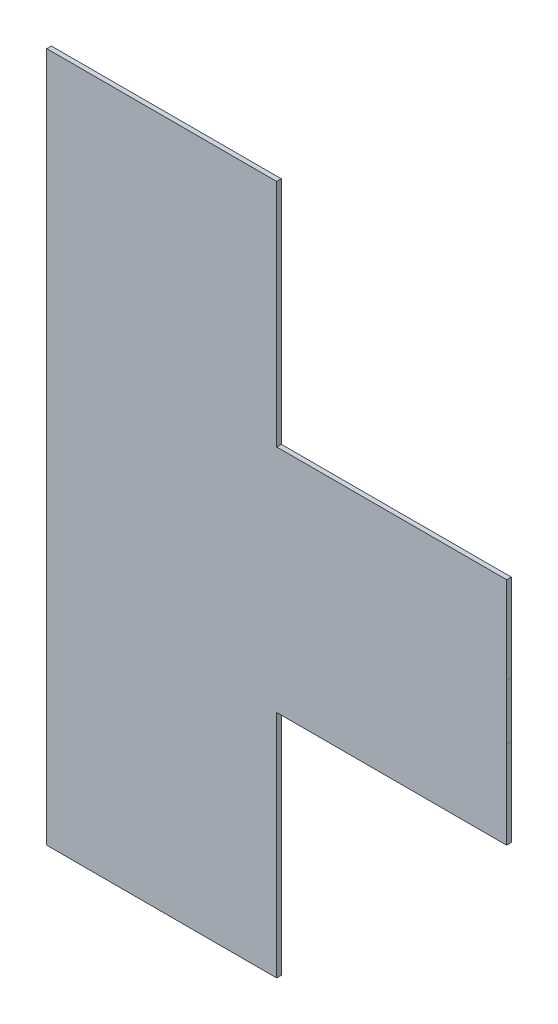
ISO-10303-21;
HEADER;
FILE_DESCRIPTION(('STEP AP214'),'2;1');
FILE_NAME('part.step','',(''),(''),'','','');
FILE_SCHEMA(('AUTOMOTIVE_DESIGN { 1 0 10303 214 1 1 1 1 }'));
ENDSEC;
DATA;
#1=APPLICATION_CONTEXT('core data for automotive mechanical design processes');
#2=APPLICATION_PROTOCOL_DEFINITION('international standard','automotive_design',2000,#1);
#3=PRODUCT_CONTEXT('',#1,'mechanical');
#4=PRODUCT('Part','Part','',(#3));
#5=PRODUCT_RELATED_PRODUCT_CATEGORY('part','',(#4));
#6=PRODUCT_DEFINITION_FORMATION('','',#4);
#7=PRODUCT_DEFINITION_CONTEXT('part definition',#1,'design');
#8=PRODUCT_DEFINITION('design','',#6,#7);
#9=PRODUCT_DEFINITION_SHAPE('','',#8);
#10=(LENGTH_UNIT() NAMED_UNIT(*) SI_UNIT(.MILLI.,.METRE.));
#11=(NAMED_UNIT(*) PLANE_ANGLE_UNIT() SI_UNIT($,.RADIAN.));
#12=(NAMED_UNIT(*) SI_UNIT($,.STERADIAN.) SOLID_ANGLE_UNIT());
#13=UNCERTAINTY_MEASURE_WITH_UNIT(LENGTH_MEASURE(1.E-05),#10,'distance_accuracy_value','');
#14=(GEOMETRIC_REPRESENTATION_CONTEXT(3) GLOBAL_UNCERTAINTY_ASSIGNED_CONTEXT((#13)) GLOBAL_UNIT_ASSIGNED_CONTEXT((#10,
#11,#12)) REPRESENTATION_CONTEXT('',''));
#15=CARTESIAN_POINT('',(0.,0.,0.));
#16=DIRECTION('',(0.,0.,1.));
#17=DIRECTION('',(1.,0.,0.));
#18=AXIS2_PLACEMENT_3D('',#15,#16,#17);
#19=CARTESIAN_POINT('',(100.,2.22044604925031E-13,1.));
#20=DIRECTION('',(1.,0.,0.));
#21=DIRECTION('',(0.,1.,0.));
#22=AXIS2_PLACEMENT_3D('',#19,#20,#21);
#23=PLANE('',#22);
#24=DIRECTION('',(0.,-1.,0.));
#25=VECTOR('',#24,1.);
#26=CARTESIAN_POINT('',(100.,2.22044604925031E-13,0.));
#27=LINE('',#26,#25);
#28=CARTESIAN_POINT('',(99.9999999999998,68.9999999999999,0.));
#29=VERTEX_POINT('',#28);
#30=CARTESIAN_POINT('',(99.9999999999999,50.,0.));
#31=VERTEX_POINT('',#30);
#32=EDGE_CURVE('E177',#29,#31,#27,.T.);
#33=ORIENTED_EDGE('',*,*,#32,.F.);
#34=DIRECTION('',(0.,0.,1.));
#35=VECTOR('',#34,1.);
#36=CARTESIAN_POINT('',(99.9999999999998,68.9999999999999,1.));
#37=LINE('',#36,#35);
#38=CARTESIAN_POINT('',(99.9999999999998,68.9999999999999,1.));
#39=VERTEX_POINT('',#38);
#40=EDGE_CURVE('E11',#29,#39,#37,.T.);
#41=ORIENTED_EDGE('',*,*,#40,.T.);
#42=DIRECTION('',(0.,-1.,0.));
#43=VECTOR('',#42,1.);
#44=CARTESIAN_POINT('',(100.,2.22044604925031E-13,1.));
#45=LINE('',#44,#43);
#46=CARTESIAN_POINT('',(99.9999999999999,50.,1.));
#47=VERTEX_POINT('',#46);
#48=EDGE_CURVE('E145',#39,#47,#45,.T.);
#49=ORIENTED_EDGE('',*,*,#48,.T.);
#50=DIRECTION('',(0.,0.,-1.));
#51=VECTOR('',#50,1.);
#52=CARTESIAN_POINT('',(99.9999999999999,50.,1.));
#53=LINE('',#52,#51);
#54=EDGE_CURVE('E172',#47,#31,#53,.T.);
#55=ORIENTED_EDGE('',*,*,#54,.T.);
#56=EDGE_LOOP('',(#33,#41,#49,#55));
#57=FACE_BOUND('',#56,.T.);
#58=ADVANCED_FACE('F49',(#57),#23,.T.);
#59=CARTESIAN_POINT('',(99.9999999999998,100.,1.));
#60=VERTEX_POINT('',#59);
#61=CARTESIAN_POINT('',(99.9999999999998,81.,1.));
#62=VERTEX_POINT('',#61);
#63=EDGE_CURVE('E128',#60,#62,#45,.T.);
#64=ORIENTED_EDGE('',*,*,#63,.T.);
#65=DIRECTION('',(0.,0.,-1.));
#66=VECTOR('',#65,1.);
#67=CARTESIAN_POINT('',(99.9999999999998,81.,1.));
#68=LINE('',#67,#66);
#69=CARTESIAN_POINT('',(99.9999999999998,81.,0.));
#70=VERTEX_POINT('',#69);
#71=EDGE_CURVE('E58',#62,#70,#68,.T.);
#72=ORIENTED_EDGE('',*,*,#71,.T.);
#73=CARTESIAN_POINT('',(99.9999999999998,100.,0.));
#74=VERTEX_POINT('',#73);
#75=EDGE_CURVE('E130',#74,#70,#27,.T.);
#76=ORIENTED_EDGE('',*,*,#75,.F.);
#77=DIRECTION('',(0.,0.,-1.));
#78=VECTOR('',#77,1.);
#79=CARTESIAN_POINT('',(99.9999999999998,100.,1.));
#80=LINE('',#79,#78);
#81=EDGE_CURVE('E125',#60,#74,#80,.T.);
#82=ORIENTED_EDGE('',*,*,#81,.F.);
#83=EDGE_LOOP('',(#64,#72,#76,#82));
#84=FACE_BOUND('',#83,.T.);
#85=ADVANCED_FACE('F127',(#84),#23,.T.);
#86=ORIENTED_EDGE('',*,*,#40,.F.);
#87=EDGE_CURVE('E176',#70,#29,#27,.T.);
#88=ORIENTED_EDGE('',*,*,#87,.F.);
#89=ORIENTED_EDGE('',*,*,#71,.F.);
#90=EDGE_CURVE('E142',#62,#39,#45,.T.);
#91=ORIENTED_EDGE('',*,*,#90,.T.);
#92=EDGE_LOOP('',(#86,#88,#89,#91));
#93=FACE_BOUND('',#92,.T.);
#94=ADVANCED_FACE('F51',(#93),#23,.T.);
#95=CARTESIAN_POINT('',(0.,100.,1.));
#96=DIRECTION('',(0.,1.,0.));
#97=DIRECTION('',(0.,0.,1.));
#98=AXIS2_PLACEMENT_3D('',#95,#96,#97);
#99=PLANE('',#98);
#100=DIRECTION('',(1.,0.,0.));
#101=VECTOR('',#100,1.);
#102=CARTESIAN_POINT('',(0.,100.,0.));
#103=LINE('',#102,#101);
#104=CARTESIAN_POINT('',(50.,100.,0.));
#105=VERTEX_POINT('',#104);
#106=EDGE_CURVE('E175',#105,#74,#103,.T.);
#107=ORIENTED_EDGE('',*,*,#106,.F.);
#108=DIRECTION('',(0.,0.,-1.));
#109=VECTOR('',#108,1.);
#110=CARTESIAN_POINT('',(50.,100.,1.));
#111=LINE('',#110,#109);
#112=CARTESIAN_POINT('',(50.,100.,1.));
#113=VERTEX_POINT('',#112);
#114=EDGE_CURVE('E136',#113,#105,#111,.T.);
#115=ORIENTED_EDGE('',*,*,#114,.F.);
#116=DIRECTION('',(1.,0.,0.));
#117=VECTOR('',#116,1.);
#118=CARTESIAN_POINT('',(0.,100.,1.));
#119=LINE('',#118,#117);
#120=EDGE_CURVE('E141',#113,#60,#119,.T.);
#121=ORIENTED_EDGE('',*,*,#120,.T.);
#122=ORIENTED_EDGE('',*,*,#81,.T.);
#123=EDGE_LOOP('',(#107,#115,#121,#122));
#124=FACE_BOUND('',#123,.T.);
#125=ADVANCED_FACE('F146',(#124),#99,.T.);
#126=CARTESIAN_POINT('',(50.,0.,1.));
#127=DIRECTION('',(-1.,0.,0.));
#128=DIRECTION('',(0.,-1.,0.));
#129=AXIS2_PLACEMENT_3D('',#126,#127,#128);
#130=PLANE('',#129);
#131=DIRECTION('',(0.,1.,0.));
#132=VECTOR('',#131,1.);
#133=CARTESIAN_POINT('',(50.,0.,0.));
#134=LINE('',#133,#132);
#135=CARTESIAN_POINT('',(50.,150.,0.));
#136=VERTEX_POINT('',#135);
#137=EDGE_CURVE('E180',#105,#136,#134,.T.);
#138=ORIENTED_EDGE('',*,*,#137,.T.);
#139=DIRECTION('',(0.,0.,-1.));
#140=VECTOR('',#139,1.);
#141=CARTESIAN_POINT('',(50.,150.,1.));
#142=LINE('',#141,#140);
#143=CARTESIAN_POINT('',(50.,150.,1.));
#144=VERTEX_POINT('',#143);
#145=EDGE_CURVE('E219',#144,#136,#142,.T.);
#146=ORIENTED_EDGE('',*,*,#145,.F.);
#147=DIRECTION('',(0.,1.,0.));
#148=VECTOR('',#147,1.);
#149=CARTESIAN_POINT('',(50.,0.,1.));
#150=LINE('',#149,#148);
#151=EDGE_CURVE('E149',#113,#144,#150,.T.);
#152=ORIENTED_EDGE('',*,*,#151,.F.);
#153=ORIENTED_EDGE('',*,*,#114,.T.);
#154=EDGE_LOOP('',(#138,#146,#152,#153));
#155=FACE_BOUND('',#154,.T.);
#156=ADVANCED_FACE('F233',(#155),#130,.F.);
#157=CARTESIAN_POINT('',(0.,150.,1.));
#158=DIRECTION('',(0.,1.,0.));
#159=DIRECTION('',(0.,0.,1.));
#160=AXIS2_PLACEMENT_3D('',#157,#158,#159);
#161=PLANE('',#160);
#162=DIRECTION('',(1.,0.,0.));
#163=VECTOR('',#162,1.);
#164=CARTESIAN_POINT('',(0.,150.,0.));
#165=LINE('',#164,#163);
#166=CARTESIAN_POINT('',(0.,150.,0.));
#167=VERTEX_POINT('',#166);
#168=EDGE_CURVE('E184',#167,#136,#165,.T.);
#169=ORIENTED_EDGE('',*,*,#168,.F.);
#170=DIRECTION('',(0.,0.,-1.));
#171=VECTOR('',#170,1.);
#172=CARTESIAN_POINT('',(0.,150.,1.));
#173=LINE('',#172,#171);
#174=CARTESIAN_POINT('',(0.,150.,1.));
#175=VERTEX_POINT('',#174);
#176=EDGE_CURVE('E216',#175,#167,#173,.T.);
#177=ORIENTED_EDGE('',*,*,#176,.F.);
#178=DIRECTION('',(1.,0.,0.));
#179=VECTOR('',#178,1.);
#180=CARTESIAN_POINT('',(0.,150.,1.));
#181=LINE('',#180,#179);
#182=EDGE_CURVE('E152',#175,#144,#181,.T.);
#183=ORIENTED_EDGE('',*,*,#182,.T.);
#184=ORIENTED_EDGE('',*,*,#145,.T.);
#185=EDGE_LOOP('',(#169,#177,#183,#184));
#186=FACE_BOUND('',#185,.T.);
#187=ADVANCED_FACE('F271',(#186),#161,.T.);
#188=CARTESIAN_POINT('',(0.,0.,1.));
#189=DIRECTION('',(-1.,0.,0.));
#190=DIRECTION('',(0.,0.,1.));
#191=AXIS2_PLACEMENT_3D('',#188,#189,#190);
#192=PLANE('',#191);
#193=DIRECTION('',(0.,1.,0.));
#194=VECTOR('',#193,1.);
#195=CARTESIAN_POINT('',(0.,0.,0.));
#196=LINE('',#195,#194);
#197=CARTESIAN_POINT('',(0.,0.,0.));
#198=VERTEX_POINT('',#197);
#199=EDGE_CURVE('E188',#198,#167,#196,.T.);
#200=ORIENTED_EDGE('',*,*,#199,.F.);
#201=DIRECTION('',(0.,0.,-1.));
#202=VECTOR('',#201,1.);
#203=CARTESIAN_POINT('',(0.,0.,1.));
#204=LINE('',#203,#202);
#205=CARTESIAN_POINT('',(0.,0.,1.));
#206=VERTEX_POINT('',#205);
#207=EDGE_CURVE('E213',#206,#198,#204,.T.);
#208=ORIENTED_EDGE('',*,*,#207,.F.);
#209=DIRECTION('',(0.,1.,0.));
#210=VECTOR('',#209,1.);
#211=CARTESIAN_POINT('',(0.,0.,1.));
#212=LINE('',#211,#210);
#213=EDGE_CURVE('E158',#206,#175,#212,.T.);
#214=ORIENTED_EDGE('',*,*,#213,.T.);
#215=ORIENTED_EDGE('',*,*,#176,.T.);
#216=EDGE_LOOP('',(#200,#208,#214,#215));
#217=FACE_BOUND('',#216,.T.);
#218=ADVANCED_FACE('F239',(#217),#192,.T.);
#219=CARTESIAN_POINT('',(0.,0.,1.));
#220=DIRECTION('',(0.,1.,0.));
#221=DIRECTION('',(0.,0.,1.));
#222=AXIS2_PLACEMENT_3D('',#219,#220,#221);
#223=PLANE('',#222);
#224=DIRECTION('',(1.,0.,0.));
#225=VECTOR('',#224,1.);
#226=CARTESIAN_POINT('',(0.,0.,0.));
#227=LINE('',#226,#225);
#228=CARTESIAN_POINT('',(50.,0.,0.));
#229=VERTEX_POINT('',#228);
#230=EDGE_CURVE('E192',#198,#229,#227,.T.);
#231=ORIENTED_EDGE('',*,*,#230,.T.);
#232=DIRECTION('',(0.,0.,-1.));
#233=VECTOR('',#232,1.);
#234=CARTESIAN_POINT('',(50.,0.,1.));
#235=LINE('',#234,#233);
#236=CARTESIAN_POINT('',(50.,0.,1.));
#237=VERTEX_POINT('',#236);
#238=EDGE_CURVE('E209',#237,#229,#235,.T.);
#239=ORIENTED_EDGE('',*,*,#238,.F.);
#240=DIRECTION('',(1.,0.,0.));
#241=VECTOR('',#240,1.);
#242=CARTESIAN_POINT('',(0.,0.,1.));
#243=LINE('',#242,#241);
#244=EDGE_CURVE('E162',#206,#237,#243,.T.);
#245=ORIENTED_EDGE('',*,*,#244,.F.);
#246=ORIENTED_EDGE('',*,*,#207,.T.);
#247=EDGE_LOOP('',(#231,#239,#245,#246));
#248=FACE_BOUND('',#247,.T.);
#249=ADVANCED_FACE('F244',(#248),#223,.F.);
#250=CARTESIAN_POINT('',(50.,0.,1.));
#251=DIRECTION('',(-1.,0.,0.));
#252=DIRECTION('',(0.,0.,1.));
#253=AXIS2_PLACEMENT_3D('',#250,#251,#252);
#254=PLANE('',#253);
#255=DIRECTION('',(0.,1.,0.));
#256=VECTOR('',#255,1.);
#257=CARTESIAN_POINT('',(50.,0.,0.));
#258=LINE('',#257,#256);
#259=CARTESIAN_POINT('',(50.,50.,0.));
#260=VERTEX_POINT('',#259);
#261=EDGE_CURVE('E195',#229,#260,#258,.T.);
#262=ORIENTED_EDGE('',*,*,#261,.T.);
#263=DIRECTION('',(0.,0.,-1.));
#264=VECTOR('',#263,1.);
#265=CARTESIAN_POINT('',(50.,50.,1.));
#266=LINE('',#265,#264);
#267=CARTESIAN_POINT('',(50.,50.,1.));
#268=VERTEX_POINT('',#267);
#269=EDGE_CURVE('E205',#268,#260,#266,.T.);
#270=ORIENTED_EDGE('',*,*,#269,.F.);
#271=DIRECTION('',(0.,1.,0.));
#272=VECTOR('',#271,1.);
#273=CARTESIAN_POINT('',(50.,0.,1.));
#274=LINE('',#273,#272);
#275=EDGE_CURVE('E165',#237,#268,#274,.T.);
#276=ORIENTED_EDGE('',*,*,#275,.F.);
#277=ORIENTED_EDGE('',*,*,#238,.T.);
#278=EDGE_LOOP('',(#262,#270,#276,#277));
#279=FACE_BOUND('',#278,.T.);
#280=ADVANCED_FACE('F250',(#279),#254,.F.);
#281=CARTESIAN_POINT('',(0.,50.,1.));
#282=DIRECTION('',(0.,1.,0.));
#283=DIRECTION('',(0.,0.,1.));
#284=AXIS2_PLACEMENT_3D('',#281,#282,#283);
#285=PLANE('',#284);
#286=DIRECTION('',(1.,0.,0.));
#287=VECTOR('',#286,1.);
#288=CARTESIAN_POINT('',(0.,50.,0.));
#289=LINE('',#288,#287);
#290=EDGE_CURVE('E198',#260,#31,#289,.T.);
#291=ORIENTED_EDGE('',*,*,#290,.T.);
#292=ORIENTED_EDGE('',*,*,#54,.F.);
#293=DIRECTION('',(1.,0.,0.));
#294=VECTOR('',#293,1.);
#295=CARTESIAN_POINT('',(0.,50.,1.));
#296=LINE('',#295,#294);
#297=EDGE_CURVE('E168',#268,#47,#296,.T.);
#298=ORIENTED_EDGE('',*,*,#297,.F.);
#299=ORIENTED_EDGE('',*,*,#269,.T.);
#300=EDGE_LOOP('',(#291,#292,#298,#299));
#301=FACE_BOUND('',#300,.T.);
#302=ADVANCED_FACE('F254',(#301),#285,.F.);
#303=CARTESIAN_POINT('',(0.,0.,1.));
#304=DIRECTION('',(0.,0.,1.));
#305=DIRECTION('',(1.,0.,0.));
#306=AXIS2_PLACEMENT_3D('',#303,#304,#305);
#307=PLANE('',#306);
#308=ORIENTED_EDGE('',*,*,#63,.F.);
#309=ORIENTED_EDGE('',*,*,#120,.F.);
#310=ORIENTED_EDGE('',*,*,#151,.T.);
#311=ORIENTED_EDGE('',*,*,#182,.F.);
#312=ORIENTED_EDGE('',*,*,#213,.F.);
#313=ORIENTED_EDGE('',*,*,#244,.T.);
#314=ORIENTED_EDGE('',*,*,#275,.T.);
#315=ORIENTED_EDGE('',*,*,#297,.T.);
#316=ORIENTED_EDGE('',*,*,#48,.F.);
#317=ORIENTED_EDGE('',*,*,#90,.F.);
#318=EDGE_LOOP('',(#308,#309,#310,#311,#312,#313,#314,#315,#316,#317));
#319=FACE_BOUND('',#318,.T.);
#320=ADVANCED_FACE('F140',(#319),#307,.T.);
#321=CARTESIAN_POINT('',(0.,0.,0.));
#322=DIRECTION('',(0.,0.,1.));
#323=DIRECTION('',(1.,0.,0.));
#324=AXIS2_PLACEMENT_3D('',#321,#322,#323);
#325=PLANE('',#324);
#326=ORIENTED_EDGE('',*,*,#75,.T.);
#327=ORIENTED_EDGE('',*,*,#87,.T.);
#328=ORIENTED_EDGE('',*,*,#32,.T.);
#329=ORIENTED_EDGE('',*,*,#290,.F.);
#330=ORIENTED_EDGE('',*,*,#261,.F.);
#331=ORIENTED_EDGE('',*,*,#230,.F.);
#332=ORIENTED_EDGE('',*,*,#199,.T.);
#333=ORIENTED_EDGE('',*,*,#168,.T.);
#334=ORIENTED_EDGE('',*,*,#137,.F.);
#335=ORIENTED_EDGE('',*,*,#106,.T.);
#336=EDGE_LOOP('',(#326,#327,#328,#329,#330,#331,#332,#333,#334,#335));
#337=FACE_BOUND('',#336,.T.);
#338=ADVANCED_FACE('F228',(#337),#325,.F.);
#339=CLOSED_SHELL('',(#58,#85,#94,#125,#156,#187,#218,#249,#280,#302,#320,#338));
#340=MANIFOLD_SOLID_BREP('B2',#339);
#341=ADVANCED_BREP_SHAPE_REPRESENTATION('',(#18,#340),#14);
#342=SHAPE_DEFINITION_REPRESENTATION(#9,#341);
ENDSEC;
END-ISO-10303-21;
